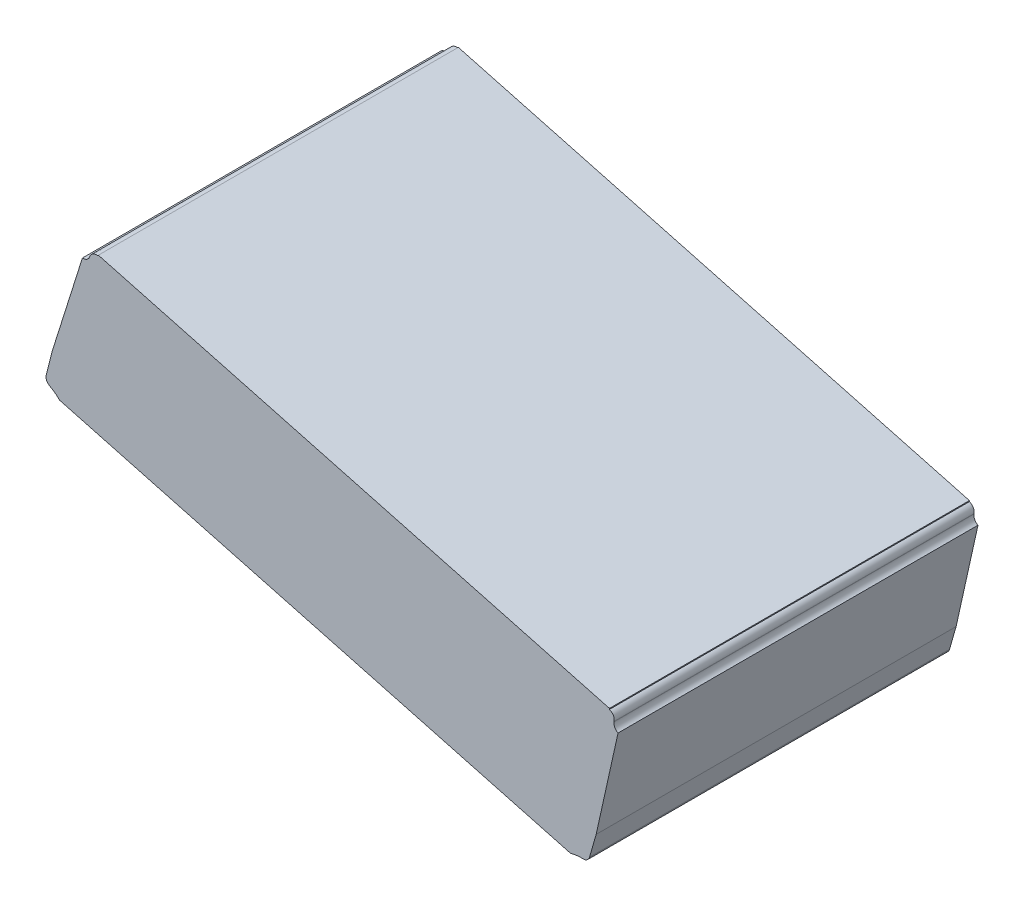
ISO-10303-21;
HEADER;
FILE_DESCRIPTION(('STEP AP214'),'2;1');
FILE_NAME('part.step','',(''),(''),'','','');
FILE_SCHEMA(('AUTOMOTIVE_DESIGN { 1 0 10303 214 1 1 1 1 }'));
ENDSEC;
DATA;
#1=APPLICATION_CONTEXT('core data for automotive mechanical design processes');
#2=APPLICATION_PROTOCOL_DEFINITION('international standard','automotive_design',2000,#1);
#3=PRODUCT_CONTEXT('',#1,'mechanical');
#4=PRODUCT('Part','Part','',(#3));
#5=PRODUCT_RELATED_PRODUCT_CATEGORY('part','',(#4));
#6=PRODUCT_DEFINITION_FORMATION('','',#4);
#7=PRODUCT_DEFINITION_CONTEXT('part definition',#1,'design');
#8=PRODUCT_DEFINITION('design','',#6,#7);
#9=PRODUCT_DEFINITION_SHAPE('','',#8);
#10=(LENGTH_UNIT() NAMED_UNIT(*) SI_UNIT(.MILLI.,.METRE.));
#11=(NAMED_UNIT(*) PLANE_ANGLE_UNIT() SI_UNIT($,.RADIAN.));
#12=(NAMED_UNIT(*) SI_UNIT($,.STERADIAN.) SOLID_ANGLE_UNIT());
#13=UNCERTAINTY_MEASURE_WITH_UNIT(LENGTH_MEASURE(1.E-05),#10,'distance_accuracy_value','');
#14=(GEOMETRIC_REPRESENTATION_CONTEXT(3) GLOBAL_UNCERTAINTY_ASSIGNED_CONTEXT((#13)) GLOBAL_UNIT_ASSIGNED_CONTEXT((#10,
#11,#12)) REPRESENTATION_CONTEXT('',''));
#15=CARTESIAN_POINT('',(0.,0.,0.));
#16=DIRECTION('',(0.,0.,1.));
#17=DIRECTION('',(1.,0.,0.));
#18=AXIS2_PLACEMENT_3D('',#15,#16,#17);
#19=CARTESIAN_POINT('',(0.,0.,100.));
#20=DIRECTION('',(0.,0.,-1.));
#21=DIRECTION('',(-1.,0.,0.));
#22=AXIS2_PLACEMENT_3D('',#19,#20,#21);
#23=CYLINDRICAL_SURFACE('',#22,76.4000818062443);
#24=CARTESIAN_POINT('',(0.,0.,0.));
#25=DIRECTION('',(0.,0.,1.));
#26=DIRECTION('',(1.,0.,0.));
#27=AXIS2_PLACEMENT_3D('',#24,#25,#26);
#28=CIRCLE('',#27,76.4000818062443);
#29=CARTESIAN_POINT('',(76.395283749018,0.856224799831026,0.));
#30=VERTEX_POINT('',#29);
#31=CARTESIAN_POINT('',(76.3919253226394,1.11635366308967,0.));
#32=VERTEX_POINT('',#31);
#33=EDGE_CURVE('E198',#30,#32,#28,.T.);
#34=ORIENTED_EDGE('',*,*,#33,.T.);
#35=DIRECTION('',(0.,0.,-1.));
#36=VECTOR('',#35,1.);
#37=CARTESIAN_POINT('',(76.3919253226394,1.11635366308967,100.));
#38=LINE('',#37,#36);
#39=CARTESIAN_POINT('',(76.3919253226394,1.11635366308967,100.));
#40=VERTEX_POINT('',#39);
#41=EDGE_CURVE('E11',#40,#32,#38,.T.);
#42=ORIENTED_EDGE('',*,*,#41,.F.);
#43=CARTESIAN_POINT('',(0.,0.,100.));
#44=DIRECTION('',(0.,0.,1.));
#45=DIRECTION('',(1.,0.,0.));
#46=AXIS2_PLACEMENT_3D('',#43,#44,#45);
#47=CIRCLE('',#46,76.4000818062443);
#48=CARTESIAN_POINT('',(76.395283749018,0.856224799831026,100.));
#49=VERTEX_POINT('',#48);
#50=EDGE_CURVE('E239',#49,#40,#47,.T.);
#51=ORIENTED_EDGE('',*,*,#50,.F.);
#52=DIRECTION('',(0.,0.,-1.));
#53=VECTOR('',#52,1.);
#54=CARTESIAN_POINT('',(76.395283749018,0.856224799831026,100.));
#55=LINE('',#54,#53);
#56=EDGE_CURVE('E197',#49,#30,#55,.T.);
#57=ORIENTED_EDGE('',*,*,#56,.T.);
#58=EDGE_LOOP('',(#34,#42,#51,#57));
#59=FACE_BOUND('',#58,.T.);
#60=ADVANCED_FACE('F41',(#59),#23,.T.);
#61=CARTESIAN_POINT('',(76.3919253226394,1.11635366308967,100.));
#62=DIRECTION('',(-0.258819045102784,-0.965925826288998,0.));
#63=DIRECTION('',(0.965925826288998,-0.258819045102784,0.));
#64=AXIS2_PLACEMENT_3D('',#61,#62,#63);
#65=PLANE('',#64);
#66=DIRECTION('',(-0.965925826288998,0.258819045102784,0.));
#67=VECTOR('',#66,1.);
#68=CARTESIAN_POINT('',(76.3919253226394,1.11635366308967,0.));
#69=LINE('',#68,#67);
#70=CARTESIAN_POINT('',(-65.5991711418433,39.162753293199,0.));
#71=VERTEX_POINT('',#70);
#72=EDGE_CURVE('E201',#32,#71,#69,.T.);
#73=ORIENTED_EDGE('',*,*,#72,.T.);
#74=DIRECTION('',(0.,0.,-1.));
#75=VECTOR('',#74,1.);
#76=CARTESIAN_POINT('',(-65.5991711418433,39.162753293199,100.));
#77=LINE('',#76,#75);
#78=CARTESIAN_POINT('',(-65.5991711418433,39.162753293199,100.));
#79=VERTEX_POINT('',#78);
#80=EDGE_CURVE('E49',#79,#71,#77,.T.);
#81=ORIENTED_EDGE('',*,*,#80,.F.);
#82=DIRECTION('',(-0.965925826288998,0.258819045102784,0.));
#83=VECTOR('',#82,1.);
#84=CARTESIAN_POINT('',(76.3919253226394,1.11635366308967,100.));
#85=LINE('',#84,#83);
#86=EDGE_CURVE('E129',#40,#79,#85,.T.);
#87=ORIENTED_EDGE('',*,*,#86,.F.);
#88=ORIENTED_EDGE('',*,*,#41,.T.);
#89=EDGE_LOOP('',(#73,#81,#87,#88));
#90=FACE_BOUND('',#89,.T.);
#91=ADVANCED_FACE('F342',(#90),#65,.F.);
#92=CARTESIAN_POINT('',(0.,0.,100.));
#93=DIRECTION('',(0.,0.,-1.));
#94=DIRECTION('',(-1.,0.,0.));
#95=AXIS2_PLACEMENT_3D('',#92,#93,#94);
#96=CYLINDRICAL_SURFACE('',#95,76.4000818062442);
#97=CARTESIAN_POINT('',(0.,0.,0.));
#98=DIRECTION('',(0.,0.,1.));
#99=DIRECTION('',(1.,0.,0.));
#100=AXIS2_PLACEMENT_3D('',#97,#98,#99);
#101=CIRCLE('',#100,76.4000818062442);
#102=CARTESIAN_POINT('',(-65.7321440560334,38.9391543025484,0.));
#103=VERTEX_POINT('',#102);
#104=EDGE_CURVE('E203',#71,#103,#101,.T.);
#105=ORIENTED_EDGE('',*,*,#104,.T.);
#106=DIRECTION('',(0.,0.,-1.));
#107=VECTOR('',#106,1.);
#108=CARTESIAN_POINT('',(-65.7321440560334,38.9391543025484,100.));
#109=LINE('',#108,#107);
#110=CARTESIAN_POINT('',(-65.7321440560334,38.9391543025484,100.));
#111=VERTEX_POINT('',#110);
#112=EDGE_CURVE('E270',#111,#103,#109,.T.);
#113=ORIENTED_EDGE('',*,*,#112,.F.);
#114=CARTESIAN_POINT('',(0.,0.,100.));
#115=DIRECTION('',(0.,0.,1.));
#116=DIRECTION('',(1.,0.,0.));
#117=AXIS2_PLACEMENT_3D('',#114,#115,#116);
#118=CIRCLE('',#117,76.4000818062442);
#119=EDGE_CURVE('E278',#79,#111,#118,.T.);
#120=ORIENTED_EDGE('',*,*,#119,.F.);
#121=ORIENTED_EDGE('',*,*,#80,.T.);
#122=EDGE_LOOP('',(#105,#113,#120,#121));
#123=FACE_BOUND('',#122,.T.);
#124=ADVANCED_FACE('F276',(#123),#96,.T.);
#125=CARTESIAN_POINT('',(-66.0939047668468,36.9721440869899,100.));
#126=DIRECTION('',(0.,0.,-1.));
#127=DIRECTION('',(-1.,0.,0.));
#128=AXIS2_PLACEMENT_3D('',#125,#126,#127);
#129=CYLINDRICAL_SURFACE('',#128,1.99999999999996);
#130=CARTESIAN_POINT('',(-66.0939047668468,36.9721440869899,0.));
#131=DIRECTION('',(0.,0.,1.));
#132=DIRECTION('',(1.,0.,0.));
#133=AXIS2_PLACEMENT_3D('',#130,#131,#132);
#134=CIRCLE('',#133,1.99999999999996);
#135=CARTESIAN_POINT('',(-67.9732900084184,37.6561843736417,0.));
#136=VERTEX_POINT('',#135);
#137=EDGE_CURVE('E205',#103,#136,#134,.T.);
#138=ORIENTED_EDGE('',*,*,#137,.T.);
#139=DIRECTION('',(0.,0.,-1.));
#140=VECTOR('',#139,1.);
#141=CARTESIAN_POINT('',(-67.9732900084184,37.6561843736417,100.));
#142=LINE('',#141,#140);
#143=CARTESIAN_POINT('',(-67.9732900084184,37.6561843736417,100.));
#144=VERTEX_POINT('',#143);
#145=EDGE_CURVE('E267',#144,#136,#142,.T.);
#146=ORIENTED_EDGE('',*,*,#145,.F.);
#147=CARTESIAN_POINT('',(-66.0939047668468,36.9721440869899,100.));
#148=DIRECTION('',(0.,0.,1.));
#149=DIRECTION('',(1.,0.,0.));
#150=AXIS2_PLACEMENT_3D('',#147,#148,#149);
#151=CIRCLE('',#150,1.99999999999996);
#152=EDGE_CURVE('E296',#111,#144,#151,.T.);
#153=ORIENTED_EDGE('',*,*,#152,.F.);
#154=ORIENTED_EDGE('',*,*,#112,.T.);
#155=EDGE_LOOP('',(#138,#146,#153,#154));
#156=FACE_BOUND('',#155,.T.);
#157=ADVANCED_FACE('F286',(#156),#129,.T.);
#158=CARTESIAN_POINT('',(-67.9732900084184,37.6561843736417,100.));
#159=DIRECTION('',(0.939692620785631,-0.34202014332643,0.));
#160=DIRECTION('',(0.34202014332643,0.939692620785632,0.));
#161=AXIS2_PLACEMENT_3D('',#158,#159,#160);
#162=PLANE('',#161);
#163=DIRECTION('',(-0.34202014332643,-0.939692620785631,0.));
#164=VECTOR('',#163,1.);
#165=CARTESIAN_POINT('',(-67.9732900084184,37.6561843736417,0.));
#166=LINE('',#165,#164);
#167=CARTESIAN_POINT('',(-68.0043013323174,37.570981461482,0.));
#168=VERTEX_POINT('',#167);
#169=EDGE_CURVE('E207',#136,#168,#166,.T.);
#170=ORIENTED_EDGE('',*,*,#169,.T.);
#171=DIRECTION('',(0.,0.,-1.));
#172=VECTOR('',#171,1.);
#173=CARTESIAN_POINT('',(-68.0043013323174,37.570981461482,100.));
#174=LINE('',#173,#172);
#175=CARTESIAN_POINT('',(-68.0043013323174,37.570981461482,100.));
#176=VERTEX_POINT('',#175);
#177=EDGE_CURVE('E265',#176,#168,#174,.T.);
#178=ORIENTED_EDGE('',*,*,#177,.F.);
#179=DIRECTION('',(-0.34202014332643,-0.939692620785631,0.));
#180=VECTOR('',#179,1.);
#181=CARTESIAN_POINT('',(-67.9732900084184,37.6561843736417,100.));
#182=LINE('',#181,#180);
#183=EDGE_CURVE('E292',#144,#176,#182,.T.);
#184=ORIENTED_EDGE('',*,*,#183,.F.);
#185=ORIENTED_EDGE('',*,*,#145,.T.);
#186=EDGE_LOOP('',(#170,#178,#184,#185));
#187=FACE_BOUND('',#186,.T.);
#188=ADVANCED_FACE('F290',(#187),#162,.F.);
#189=CARTESIAN_POINT('',(-69.883686573889,38.2550217481339,100.));
#190=DIRECTION('',(0.,0.,-1.));
#191=DIRECTION('',(-1.,0.,0.));
#192=AXIS2_PLACEMENT_3D('',#189,#190,#191);
#193=CYLINDRICAL_SURFACE('',#192,2.);
#194=CARTESIAN_POINT('',(-69.883686573889,38.2550217481339,0.));
#195=DIRECTION('',(0.,0.,1.));
#196=DIRECTION('',(1.,0.,0.));
#197=AXIS2_PLACEMENT_3D('',#194,#195,#196);
#198=CIRCLE('',#197,2.);
#199=CARTESIAN_POINT('',(-70.0307271560426,36.2604343052776,0.));
#200=VERTEX_POINT('',#199);
#201=EDGE_CURVE('E210',#200,#168,#198,.T.);
#202=ORIENTED_EDGE('',*,*,#201,.F.);
#203=DIRECTION('',(0.,0.,-1.));
#204=VECTOR('',#203,1.);
#205=CARTESIAN_POINT('',(-70.0307271560426,36.2604343052776,100.));
#206=LINE('',#205,#204);
#207=CARTESIAN_POINT('',(-70.0307271560426,36.2604343052776,100.));
#208=VERTEX_POINT('',#207);
#209=EDGE_CURVE('E263',#208,#200,#206,.T.);
#210=ORIENTED_EDGE('',*,*,#209,.F.);
#211=CARTESIAN_POINT('',(-69.883686573889,38.2550217481339,100.));
#212=DIRECTION('',(0.,0.,1.));
#213=DIRECTION('',(1.,0.,0.));
#214=AXIS2_PLACEMENT_3D('',#211,#212,#213);
#215=CIRCLE('',#214,2.);
#216=EDGE_CURVE('E295',#208,#176,#215,.T.);
#217=ORIENTED_EDGE('',*,*,#216,.T.);
#218=ORIENTED_EDGE('',*,*,#177,.T.);
#219=EDGE_LOOP('',(#202,#210,#217,#218));
#220=FACE_BOUND('',#219,.T.);
#221=ADVANCED_FACE('F355',(#220),#193,.F.);
#222=CARTESIAN_POINT('',(-70.0307271560426,36.2604343052776,100.));
#223=DIRECTION('',(0.953716950748144,-0.300705799504536,0.));
#224=DIRECTION('',(0.300705799504536,0.953716950748144,0.));
#225=AXIS2_PLACEMENT_3D('',#222,#223,#224);
#226=PLANE('',#225);
#227=DIRECTION('',(-0.300705799504536,-0.953716950748144,0.));
#228=VECTOR('',#227,1.);
#229=CARTESIAN_POINT('',(-70.0307271560426,36.2604343052776,0.));
#230=LINE('',#229,#228);
#231=CARTESIAN_POINT('',(-78.4799796104793,9.46282913695728,0.));
#232=VERTEX_POINT('',#231);
#233=EDGE_CURVE('E213',#200,#232,#230,.T.);
#234=ORIENTED_EDGE('',*,*,#233,.T.);
#235=DIRECTION('',(0.,0.,-1.));
#236=VECTOR('',#235,1.);
#237=CARTESIAN_POINT('',(-78.4799796104793,9.46282913695728,100.));
#238=LINE('',#237,#236);
#239=CARTESIAN_POINT('',(-78.4799796104793,9.46282913695728,100.));
#240=VERTEX_POINT('',#239);
#241=EDGE_CURVE('E260',#240,#232,#238,.T.);
#242=ORIENTED_EDGE('',*,*,#241,.F.);
#243=DIRECTION('',(-0.300705799504536,-0.953716950748144,0.));
#244=VECTOR('',#243,1.);
#245=CARTESIAN_POINT('',(-70.0307271560426,36.2604343052776,100.));
#246=LINE('',#245,#244);
#247=EDGE_CURVE('E298',#208,#240,#246,.T.);
#248=ORIENTED_EDGE('',*,*,#247,.F.);
#249=ORIENTED_EDGE('',*,*,#209,.T.);
#250=EDGE_LOOP('',(#234,#242,#248,#249));
#251=FACE_BOUND('',#250,.T.);
#252=ADVANCED_FACE('F358',(#251),#226,.F.);
#253=CARTESIAN_POINT('',(-78.4799796104793,9.46282913695728,100.));
#254=DIRECTION('',(0.970295726275931,-0.241921895599931,0.));
#255=DIRECTION('',(0.241921895599931,0.970295726275931,0.));
#256=AXIS2_PLACEMENT_3D('',#253,#254,#255);
#257=PLANE('',#256);
#258=DIRECTION('',(-0.241921895599931,-0.970295726275931,0.));
#259=VECTOR('',#258,1.);
#260=CARTESIAN_POINT('',(-78.4799796104793,9.46282913695728,0.));
#261=LINE('',#260,#259);
#262=CARTESIAN_POINT('',(-80.0913503433509,2.99997412470562,0.));
#263=VERTEX_POINT('',#262);
#264=EDGE_CURVE('E215',#232,#263,#261,.T.);
#265=ORIENTED_EDGE('',*,*,#264,.T.);
#266=DIRECTION('',(0.,0.,-1.));
#267=VECTOR('',#266,1.);
#268=CARTESIAN_POINT('',(-80.0913503433509,2.99997412470562,100.));
#269=LINE('',#268,#267);
#270=CARTESIAN_POINT('',(-80.0913503433509,2.99997412470562,100.));
#271=VERTEX_POINT('',#270);
#272=EDGE_CURVE('E257',#271,#263,#269,.T.);
#273=ORIENTED_EDGE('',*,*,#272,.F.);
#274=DIRECTION('',(-0.241921895599931,-0.970295726275931,0.));
#275=VECTOR('',#274,1.);
#276=CARTESIAN_POINT('',(-78.4799796104793,9.46282913695728,100.));
#277=LINE('',#276,#275);
#278=EDGE_CURVE('E304',#240,#271,#277,.T.);
#279=ORIENTED_EDGE('',*,*,#278,.F.);
#280=ORIENTED_EDGE('',*,*,#241,.T.);
#281=EDGE_LOOP('',(#265,#273,#279,#280));
#282=FACE_BOUND('',#281,.T.);
#283=ADVANCED_FACE('F362',(#282),#257,.F.);
#284=CARTESIAN_POINT('',(-78.3448180360542,2.56451471262571,100.));
#285=DIRECTION('',(0.,0.,-1.));
#286=DIRECTION('',(-1.,0.,0.));
#287=AXIS2_PLACEMENT_3D('',#284,#285,#286);
#288=CYLINDRICAL_SURFACE('',#287,1.80000000000003);
#289=CARTESIAN_POINT('',(-78.3448180360542,2.56451471262571,0.));
#290=DIRECTION('',(0.,0.,1.));
#291=DIRECTION('',(1.,0.,0.));
#292=AXIS2_PLACEMENT_3D('',#289,#290,#291);
#293=CIRCLE('',#292,1.80000000000003);
#294=CARTESIAN_POINT('',(-79.1594918445188,0.959426993589189,0.));
#295=VERTEX_POINT('',#294);
#296=EDGE_CURVE('E217',#263,#295,#293,.T.);
#297=ORIENTED_EDGE('',*,*,#296,.T.);
#298=DIRECTION('',(0.,0.,-1.));
#299=VECTOR('',#298,1.);
#300=CARTESIAN_POINT('',(-79.1594918445188,0.959426993589189,100.));
#301=LINE('',#300,#299);
#302=CARTESIAN_POINT('',(-79.1594918445188,0.959426993589189,100.));
#303=VERTEX_POINT('',#302);
#304=EDGE_CURVE('E255',#303,#295,#301,.T.);
#305=ORIENTED_EDGE('',*,*,#304,.F.);
#306=CARTESIAN_POINT('',(-78.3448180360542,2.56451471262571,100.));
#307=DIRECTION('',(0.,0.,1.));
#308=DIRECTION('',(1.,0.,0.));
#309=AXIS2_PLACEMENT_3D('',#306,#307,#308);
#310=CIRCLE('',#309,1.80000000000003);
#311=EDGE_CURVE('E306',#271,#303,#310,.T.);
#312=ORIENTED_EDGE('',*,*,#311,.F.);
#313=ORIENTED_EDGE('',*,*,#272,.T.);
#314=EDGE_LOOP('',(#297,#305,#312,#313));
#315=FACE_BOUND('',#314,.T.);
#316=ADVANCED_FACE('F366',(#315),#288,.T.);
#317=CARTESIAN_POINT('',(-83.6854574471001,-7.95772700105782,100.));
#318=DIRECTION('',(0.,0.,-1.));
#319=DIRECTION('',(-1.,0.,0.));
#320=AXIS2_PLACEMENT_3D('',#317,#318,#319);
#321=CYLINDRICAL_SURFACE('',#320,9.99999999999993);
#322=CARTESIAN_POINT('',(-83.6854574471001,-7.95772700105782,0.));
#323=DIRECTION('',(0.,0.,1.));
#324=DIRECTION('',(1.,0.,0.));
#325=AXIS2_PLACEMENT_3D('',#322,#323,#324);
#326=CIRCLE('',#325,9.99999999999993);
#327=CARTESIAN_POINT('',(-76.3919253226395,-1.11635366308979,0.));
#328=VERTEX_POINT('',#327);
#329=EDGE_CURVE('E220',#328,#295,#326,.T.);
#330=ORIENTED_EDGE('',*,*,#329,.F.);
#331=DIRECTION('',(0.,0.,-1.));
#332=VECTOR('',#331,1.);
#333=CARTESIAN_POINT('',(-76.3919253226395,-1.11635366308979,100.));
#334=LINE('',#333,#332);
#335=CARTESIAN_POINT('',(-76.3919253226395,-1.11635366308979,100.));
#336=VERTEX_POINT('',#335);
#337=EDGE_CURVE('E253',#336,#328,#334,.T.);
#338=ORIENTED_EDGE('',*,*,#337,.F.);
#339=CARTESIAN_POINT('',(-83.6854574471001,-7.95772700105782,100.));
#340=DIRECTION('',(0.,0.,1.));
#341=DIRECTION('',(1.,0.,0.));
#342=AXIS2_PLACEMENT_3D('',#339,#340,#341);
#343=CIRCLE('',#342,9.99999999999993);
#344=EDGE_CURVE('E308',#336,#303,#343,.T.);
#345=ORIENTED_EDGE('',*,*,#344,.T.);
#346=ORIENTED_EDGE('',*,*,#304,.T.);
#347=EDGE_LOOP('',(#330,#338,#345,#346));
#348=FACE_BOUND('',#347,.T.);
#349=ADVANCED_FACE('F370',(#348),#321,.F.);
#350=CARTESIAN_POINT('',(-76.3919253226395,-1.11635366308978,100.));
#351=DIRECTION('',(0.258819045102784,0.965925826288998,0.));
#352=DIRECTION('',(-0.965925826288998,0.258819045102784,0.));
#353=AXIS2_PLACEMENT_3D('',#350,#351,#352);
#354=PLANE('',#353);
#355=DIRECTION('',(0.965925826288998,-0.258819045102784,0.));
#356=VECTOR('',#355,1.);
#357=CARTESIAN_POINT('',(-76.3919253226395,-1.11635366308978,0.));
#358=LINE('',#357,#356);
#359=CARTESIAN_POINT('',(65.5991711418433,-39.1627532931991,0.));
#360=VERTEX_POINT('',#359);
#361=EDGE_CURVE('E223',#328,#360,#358,.T.);
#362=ORIENTED_EDGE('',*,*,#361,.T.);
#363=DIRECTION('',(0.,0.,-1.));
#364=VECTOR('',#363,1.);
#365=CARTESIAN_POINT('',(65.5991711418433,-39.1627532931991,100.));
#366=LINE('',#365,#364);
#367=CARTESIAN_POINT('',(65.5991711418433,-39.1627532931991,100.));
#368=VERTEX_POINT('',#367);
#369=EDGE_CURVE('E251',#368,#360,#366,.T.);
#370=ORIENTED_EDGE('',*,*,#369,.F.);
#371=DIRECTION('',(0.965925826288998,-0.258819045102784,0.));
#372=VECTOR('',#371,1.);
#373=CARTESIAN_POINT('',(-76.3919253226395,-1.11635366308978,100.));
#374=LINE('',#373,#372);
#375=EDGE_CURVE('E311',#336,#368,#374,.T.);
#376=ORIENTED_EDGE('',*,*,#375,.F.);
#377=ORIENTED_EDGE('',*,*,#337,.T.);
#378=EDGE_LOOP('',(#362,#370,#376,#377));
#379=FACE_BOUND('',#378,.T.);
#380=ADVANCED_FACE('F374',(#379),#354,.F.);
#381=CARTESIAN_POINT('',(68.4948685759556,-48.7343224628846,100.));
#382=DIRECTION('',(0.,0.,-1.));
#383=DIRECTION('',(-1.,0.,0.));
#384=AXIS2_PLACEMENT_3D('',#381,#382,#383);
#385=CYLINDRICAL_SURFACE('',#384,9.99999999999995);
#386=CARTESIAN_POINT('',(68.4948685759556,-48.7343224628846,0.));
#387=DIRECTION('',(0.,0.,1.));
#388=DIRECTION('',(1.,0.,0.));
#389=AXIS2_PLACEMENT_3D('',#386,#387,#388);
#390=CIRCLE('',#389,9.99999999999995);
#391=CARTESIAN_POINT('',(69.0338443847941,-38.748857772772,0.));
#392=VERTEX_POINT('',#391);
#393=EDGE_CURVE('E226',#392,#360,#390,.T.);
#394=ORIENTED_EDGE('',*,*,#393,.F.);
#395=DIRECTION('',(0.,0.,-1.));
#396=VECTOR('',#395,1.);
#397=CARTESIAN_POINT('',(69.0338443847941,-38.748857772772,100.));
#398=LINE('',#397,#396);
#399=CARTESIAN_POINT('',(69.0338443847941,-38.748857772772,100.));
#400=VERTEX_POINT('',#399);
#401=EDGE_CURVE('E249',#400,#392,#398,.T.);
#402=ORIENTED_EDGE('',*,*,#401,.F.);
#403=CARTESIAN_POINT('',(68.4948685759556,-48.7343224628846,100.));
#404=DIRECTION('',(0.,0.,1.));
#405=DIRECTION('',(1.,0.,0.));
#406=AXIS2_PLACEMENT_3D('',#403,#404,#405);
#407=CIRCLE('',#406,9.99999999999995);
#408=EDGE_CURVE('E313',#400,#368,#407,.T.);
#409=ORIENTED_EDGE('',*,*,#408,.T.);
#410=ORIENTED_EDGE('',*,*,#369,.T.);
#411=EDGE_LOOP('',(#394,#402,#409,#410));
#412=FACE_BOUND('',#411,.T.);
#413=ADVANCED_FACE('F378',(#412),#385,.F.);
#414=CARTESIAN_POINT('',(69.130860030385,-36.9514741285516,100.));
#415=DIRECTION('',(0.,0.,-1.));
#416=DIRECTION('',(-1.,0.,0.));
#417=AXIS2_PLACEMENT_3D('',#414,#415,#416);
#418=CYLINDRICAL_SURFACE('',#417,1.80000000000006);
#419=CARTESIAN_POINT('',(69.130860030385,-36.9514741285516,0.));
#420=DIRECTION('',(0.,0.,1.));
#421=DIRECTION('',(1.,0.,0.));
#422=AXIS2_PLACEMENT_3D('',#419,#420,#421);
#423=CIRCLE('',#422,1.80000000000006);
#424=CARTESIAN_POINT('',(70.8611310830739,-37.4476213690227,0.));
#425=VERTEX_POINT('',#424);
#426=EDGE_CURVE('E229',#392,#425,#423,.T.);
#427=ORIENTED_EDGE('',*,*,#426,.T.);
#428=DIRECTION('',(0.,0.,-1.));
#429=VECTOR('',#428,1.);
#430=CARTESIAN_POINT('',(70.8611310830739,-37.4476213690227,100.));
#431=LINE('',#430,#429);
#432=CARTESIAN_POINT('',(70.8611310830739,-37.4476213690227,100.));
#433=VERTEX_POINT('',#432);
#434=EDGE_CURVE('E246',#433,#425,#431,.T.);
#435=ORIENTED_EDGE('',*,*,#434,.F.);
#436=CARTESIAN_POINT('',(69.130860030385,-36.9514741285516,100.));
#437=DIRECTION('',(0.,0.,1.));
#438=DIRECTION('',(1.,0.,0.));
#439=AXIS2_PLACEMENT_3D('',#436,#437,#438);
#440=CIRCLE('',#439,1.80000000000006);
#441=EDGE_CURVE('E316',#400,#433,#440,.T.);
#442=ORIENTED_EDGE('',*,*,#441,.F.);
#443=ORIENTED_EDGE('',*,*,#401,.T.);
#444=EDGE_LOOP('',(#427,#435,#442,#443));
#445=FACE_BOUND('',#444,.T.);
#446=ADVANCED_FACE('F382',(#445),#418,.T.);
#447=CARTESIAN_POINT('',(70.8611310830739,-37.4476213690227,100.));
#448=DIRECTION('',(-0.961261695938239,0.275637355817276,0.));
#449=DIRECTION('',(-0.275637355817276,-0.96126169593824,0.));
#450=AXIS2_PLACEMENT_3D('',#447,#448,#449);
#451=PLANE('',#450);
#452=DIRECTION('',(0.275637355817276,0.961261695938239,0.));
#453=VECTOR('',#452,1.);
#454=CARTESIAN_POINT('',(70.8611310830739,-37.4476213690227,0.));
#455=LINE('',#454,#453);
#456=CARTESIAN_POINT('',(72.6970705996216,-31.0449393810028,0.));
#457=VERTEX_POINT('',#456);
#458=EDGE_CURVE('E231',#425,#457,#455,.T.);
#459=ORIENTED_EDGE('',*,*,#458,.T.);
#460=DIRECTION('',(0.,0.,-1.));
#461=VECTOR('',#460,1.);
#462=CARTESIAN_POINT('',(72.6970705996216,-31.0449393810028,100.));
#463=LINE('',#462,#461);
#464=CARTESIAN_POINT('',(72.6970705996216,-31.0449393810028,100.));
#465=VERTEX_POINT('',#464);
#466=EDGE_CURVE('E243',#465,#457,#463,.T.);
#467=ORIENTED_EDGE('',*,*,#466,.F.);
#468=DIRECTION('',(0.275637355817276,0.961261695938239,0.));
#469=VECTOR('',#468,1.);
#470=CARTESIAN_POINT('',(70.8611310830739,-37.4476213690227,100.));
#471=LINE('',#470,#469);
#472=EDGE_CURVE('E192',#433,#465,#471,.T.);
#473=ORIENTED_EDGE('',*,*,#472,.F.);
#474=ORIENTED_EDGE('',*,*,#434,.T.);
#475=EDGE_LOOP('',(#459,#467,#473,#474));
#476=FACE_BOUND('',#475,.T.);
#477=ADVANCED_FACE('F323',(#476),#451,.F.);
#478=CARTESIAN_POINT('',(72.6970705996216,-31.0449393810028,100.));
#479=DIRECTION('',(-0.976296007119877,0.216439613938358,0.));
#480=DIRECTION('',(-0.216439613938358,-0.976296007119877,0.));
#481=AXIS2_PLACEMENT_3D('',#478,#479,#480);
#482=PLANE('',#481);
#483=DIRECTION('',(0.216439613938358,0.976296007119877,0.));
#484=VECTOR('',#483,1.);
#485=CARTESIAN_POINT('',(72.6970705996216,-31.0449393810028,0.));
#486=LINE('',#485,#484);
#487=CARTESIAN_POINT('',(78.7786059152664,-3.61290631743667,0.));
#488=VERTEX_POINT('',#487);
#489=EDGE_CURVE('E233',#457,#488,#486,.T.);
#490=ORIENTED_EDGE('',*,*,#489,.T.);
#491=DIRECTION('',(0.,0.,-1.));
#492=VECTOR('',#491,1.);
#493=CARTESIAN_POINT('',(78.7786059152664,-3.61290631743667,100.));
#494=LINE('',#493,#492);
#495=CARTESIAN_POINT('',(78.7786059152664,-3.61290631743667,100.));
#496=VERTEX_POINT('',#495);
#497=EDGE_CURVE('E181',#496,#488,#494,.T.);
#498=ORIENTED_EDGE('',*,*,#497,.F.);
#499=DIRECTION('',(0.216439613938358,0.976296007119877,0.));
#500=VECTOR('',#499,1.);
#501=CARTESIAN_POINT('',(72.6970705996216,-31.0449393810028,100.));
#502=LINE('',#501,#500);
#503=EDGE_CURVE('E189',#465,#496,#502,.T.);
#504=ORIENTED_EDGE('',*,*,#503,.F.);
#505=ORIENTED_EDGE('',*,*,#466,.T.);
#506=EDGE_LOOP('',(#490,#498,#504,#505));
#507=FACE_BOUND('',#506,.T.);
#508=ADVANCED_FACE('F327',(#507),#482,.F.);
#509=CARTESIAN_POINT('',(79.6485587571633,-1.81202263077739,100.));
#510=DIRECTION('',(0.,0.,-1.));
#511=DIRECTION('',(-1.,0.,0.));
#512=AXIS2_PLACEMENT_3D('',#509,#510,#511);
#513=CYLINDRICAL_SURFACE('',#512,1.99999999999999);
#514=CARTESIAN_POINT('',(79.6485587571633,-1.81202263077739,0.));
#515=DIRECTION('',(0.,0.,1.));
#516=DIRECTION('',(1.,0.,0.));
#517=AXIS2_PLACEMENT_3D('',#514,#515,#516);
#518=CIRCLE('',#517,1.99999999999999);
#519=CARTESIAN_POINT('',(77.678943251139,-1.46472627544303,0.));
#520=VERTEX_POINT('',#519);
#521=EDGE_CURVE('E180',#520,#488,#518,.T.);
#522=ORIENTED_EDGE('',*,*,#521,.F.);
#523=DIRECTION('',(0.,0.,-1.));
#524=VECTOR('',#523,1.);
#525=CARTESIAN_POINT('',(77.678943251139,-1.46472627544303,100.));
#526=LINE('',#525,#524);
#527=CARTESIAN_POINT('',(77.678943251139,-1.46472627544303,100.));
#528=VERTEX_POINT('',#527);
#529=EDGE_CURVE('E174',#528,#520,#526,.T.);
#530=ORIENTED_EDGE('',*,*,#529,.F.);
#531=CARTESIAN_POINT('',(79.6485587571633,-1.81202263077739,100.));
#532=DIRECTION('',(0.,0.,1.));
#533=DIRECTION('',(1.,0.,0.));
#534=AXIS2_PLACEMENT_3D('',#531,#532,#533);
#535=CIRCLE('',#534,1.99999999999999);
#536=EDGE_CURVE('E178',#528,#496,#535,.T.);
#537=ORIENTED_EDGE('',*,*,#536,.T.);
#538=ORIENTED_EDGE('',*,*,#497,.T.);
#539=EDGE_LOOP('',(#522,#530,#537,#538));
#540=FACE_BOUND('',#539,.T.);
#541=ADVANCED_FACE('F176',(#540),#513,.F.);
#542=CARTESIAN_POINT('',(77.678943251139,-1.46472627544303,100.));
#543=DIRECTION('',(-0.984807753012143,0.173648177667297,0.));
#544=DIRECTION('',(-0.173648177667297,-0.984807753012144,0.));
#545=AXIS2_PLACEMENT_3D('',#542,#543,#544);
#546=PLANE('',#545);
#547=DIRECTION('',(0.173648177667297,0.984807753012143,0.));
#548=VECTOR('',#547,1.);
#549=CARTESIAN_POINT('',(77.678943251139,-1.46472627544303,0.));
#550=LINE('',#549,#548);
#551=CARTESIAN_POINT('',(77.6946881129174,-1.37543272708685,0.));
#552=VERTEX_POINT('',#551);
#553=EDGE_CURVE('E115',#520,#552,#550,.T.);
#554=ORIENTED_EDGE('',*,*,#553,.T.);
#555=DIRECTION('',(0.,0.,-1.));
#556=VECTOR('',#555,1.);
#557=CARTESIAN_POINT('',(77.6946881129174,-1.37543272708685,100.));
#558=LINE('',#557,#556);
#559=CARTESIAN_POINT('',(77.6946881129174,-1.37543272708685,100.));
#560=VERTEX_POINT('',#559);
#561=EDGE_CURVE('E182',#560,#552,#558,.T.);
#562=ORIENTED_EDGE('',*,*,#561,.F.);
#563=DIRECTION('',(0.173648177667297,0.984807753012143,0.));
#564=VECTOR('',#563,1.);
#565=CARTESIAN_POINT('',(77.678943251139,-1.46472627544303,100.));
#566=LINE('',#565,#564);
#567=EDGE_CURVE('E184',#528,#560,#566,.T.);
#568=ORIENTED_EDGE('',*,*,#567,.F.);
#569=ORIENTED_EDGE('',*,*,#529,.T.);
#570=EDGE_LOOP('',(#554,#562,#568,#569));
#571=FACE_BOUND('',#570,.T.);
#572=ADVANCED_FACE('F185',(#571),#546,.F.);
#573=CARTESIAN_POINT('',(75.7250726068931,-1.02813637175249,100.));
#574=DIRECTION('',(0.,0.,-1.));
#575=DIRECTION('',(-1.,0.,0.));
#576=AXIS2_PLACEMENT_3D('',#573,#574,#575);
#577=CYLINDRICAL_SURFACE('',#576,1.99999999999999);
#578=CARTESIAN_POINT('',(75.7250726068931,-1.02813637175249,0.));
#579=DIRECTION('',(0.,0.,1.));
#580=DIRECTION('',(1.,0.,0.));
#581=AXIS2_PLACEMENT_3D('',#578,#579,#580);
#582=CIRCLE('',#581,1.99999999999999);
#583=EDGE_CURVE('E121',#552,#30,#582,.T.);
#584=ORIENTED_EDGE('',*,*,#583,.T.);
#585=ORIENTED_EDGE('',*,*,#56,.F.);
#586=CARTESIAN_POINT('',(75.7250726068931,-1.02813637175249,100.));
#587=DIRECTION('',(0.,0.,1.));
#588=DIRECTION('',(1.,0.,0.));
#589=AXIS2_PLACEMENT_3D('',#586,#587,#588);
#590=CIRCLE('',#589,1.99999999999999);
#591=EDGE_CURVE('E57',#560,#49,#590,.T.);
#592=ORIENTED_EDGE('',*,*,#591,.F.);
#593=ORIENTED_EDGE('',*,*,#561,.T.);
#594=EDGE_LOOP('',(#584,#585,#592,#593));
#595=FACE_BOUND('',#594,.T.);
#596=ADVANCED_FACE('F331',(#595),#577,.T.);
#597=CARTESIAN_POINT('',(0.,0.,100.));
#598=DIRECTION('',(0.,0.,1.));
#599=DIRECTION('',(1.,0.,0.));
#600=AXIS2_PLACEMENT_3D('',#597,#598,#599);
#601=PLANE('',#600);
#602=ORIENTED_EDGE('',*,*,#50,.T.);
#603=ORIENTED_EDGE('',*,*,#86,.T.);
#604=ORIENTED_EDGE('',*,*,#119,.T.);
#605=ORIENTED_EDGE('',*,*,#152,.T.);
#606=ORIENTED_EDGE('',*,*,#183,.T.);
#607=ORIENTED_EDGE('',*,*,#216,.F.);
#608=ORIENTED_EDGE('',*,*,#247,.T.);
#609=ORIENTED_EDGE('',*,*,#278,.T.);
#610=ORIENTED_EDGE('',*,*,#311,.T.);
#611=ORIENTED_EDGE('',*,*,#344,.F.);
#612=ORIENTED_EDGE('',*,*,#375,.T.);
#613=ORIENTED_EDGE('',*,*,#408,.F.);
#614=ORIENTED_EDGE('',*,*,#441,.T.);
#615=ORIENTED_EDGE('',*,*,#472,.T.);
#616=ORIENTED_EDGE('',*,*,#503,.T.);
#617=ORIENTED_EDGE('',*,*,#536,.F.);
#618=ORIENTED_EDGE('',*,*,#567,.T.);
#619=ORIENTED_EDGE('',*,*,#591,.T.);
#620=EDGE_LOOP('',(#602,#603,#604,#605,#606,#607,#608,#609,#610,#611,#612,#613,#614,#615,#616,
#617,#618,#619));
#621=FACE_BOUND('',#620,.T.);
#622=ADVANCED_FACE('F187',(#621),#601,.T.);
#623=CARTESIAN_POINT('',(0.,0.,0.));
#624=DIRECTION('',(0.,0.,1.));
#625=DIRECTION('',(1.,0.,0.));
#626=AXIS2_PLACEMENT_3D('',#623,#624,#625);
#627=PLANE('',#626);
#628=ORIENTED_EDGE('',*,*,#33,.F.);
#629=ORIENTED_EDGE('',*,*,#583,.F.);
#630=ORIENTED_EDGE('',*,*,#553,.F.);
#631=ORIENTED_EDGE('',*,*,#521,.T.);
#632=ORIENTED_EDGE('',*,*,#489,.F.);
#633=ORIENTED_EDGE('',*,*,#458,.F.);
#634=ORIENTED_EDGE('',*,*,#426,.F.);
#635=ORIENTED_EDGE('',*,*,#393,.T.);
#636=ORIENTED_EDGE('',*,*,#361,.F.);
#637=ORIENTED_EDGE('',*,*,#329,.T.);
#638=ORIENTED_EDGE('',*,*,#296,.F.);
#639=ORIENTED_EDGE('',*,*,#264,.F.);
#640=ORIENTED_EDGE('',*,*,#233,.F.);
#641=ORIENTED_EDGE('',*,*,#201,.T.);
#642=ORIENTED_EDGE('',*,*,#169,.F.);
#643=ORIENTED_EDGE('',*,*,#137,.F.);
#644=ORIENTED_EDGE('',*,*,#104,.F.);
#645=ORIENTED_EDGE('',*,*,#72,.F.);
#646=EDGE_LOOP('',(#628,#629,#630,#631,#632,#633,#634,#635,#636,#637,#638,#639,#640,#641,#642,
#643,#644,#645));
#647=FACE_BOUND('',#646,.T.);
#648=ADVANCED_FACE('F282',(#647),#627,.F.);
#649=CLOSED_SHELL('',(#60,#91,#124,#157,#188,#221,#252,#283,#316,#349,#380,#413,#446,#477,#508,
#541,#572,#596,#622,#648));
#650=MANIFOLD_SOLID_BREP('B2',#649);
#651=ADVANCED_BREP_SHAPE_REPRESENTATION('',(#18,#650),#14);
#652=SHAPE_DEFINITION_REPRESENTATION(#9,#651);
ENDSEC;
END-ISO-10303-21;
